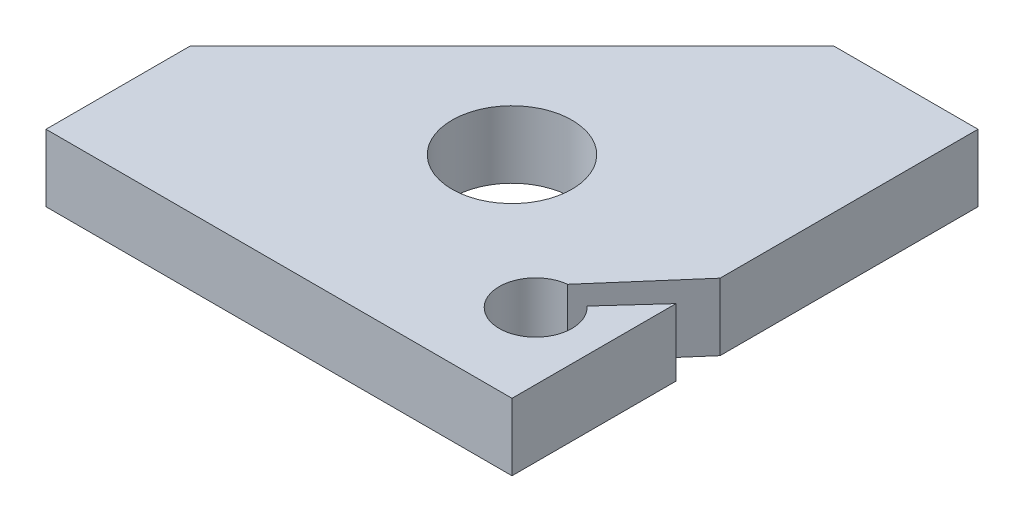
ISO-10303-21;
HEADER;
FILE_DESCRIPTION(('STEP AP214'),'2;1');
FILE_NAME('part.step','',(''),(''),'','','');
FILE_SCHEMA(('AUTOMOTIVE_DESIGN { 1 0 10303 214 1 1 1 1 }'));
ENDSEC;
DATA;
#1=APPLICATION_CONTEXT('core data for automotive mechanical design processes');
#2=APPLICATION_PROTOCOL_DEFINITION('international standard','automotive_design',2000,#1);
#3=PRODUCT_CONTEXT('',#1,'mechanical');
#4=PRODUCT('Part','Part','',(#3));
#5=PRODUCT_RELATED_PRODUCT_CATEGORY('part','',(#4));
#6=PRODUCT_DEFINITION_FORMATION('','',#4);
#7=PRODUCT_DEFINITION_CONTEXT('part definition',#1,'design');
#8=PRODUCT_DEFINITION('design','',#6,#7);
#9=PRODUCT_DEFINITION_SHAPE('','',#8);
#10=(LENGTH_UNIT() NAMED_UNIT(*) SI_UNIT(.MILLI.,.METRE.));
#11=(NAMED_UNIT(*) PLANE_ANGLE_UNIT() SI_UNIT($,.RADIAN.));
#12=(NAMED_UNIT(*) SI_UNIT($,.STERADIAN.) SOLID_ANGLE_UNIT());
#13=UNCERTAINTY_MEASURE_WITH_UNIT(LENGTH_MEASURE(1.E-05),#10,'distance_accuracy_value','');
#14=(GEOMETRIC_REPRESENTATION_CONTEXT(3) GLOBAL_UNCERTAINTY_ASSIGNED_CONTEXT((#13)) GLOBAL_UNIT_ASSIGNED_CONTEXT((#10,
#11,#12)) REPRESENTATION_CONTEXT('',''));
#15=CARTESIAN_POINT('',(0.,0.,0.));
#16=DIRECTION('',(0.,0.,1.));
#17=DIRECTION('',(1.,0.,0.));
#18=AXIS2_PLACEMENT_3D('',#15,#16,#17);
#19=CARTESIAN_POINT('',(80.3728592160939,7.,102.56766366229));
#20=DIRECTION('',(0.,1.,0.));
#21=DIRECTION('',(0.,0.,1.));
#22=AXIS2_PLACEMENT_3D('',#19,#20,#21);
#23=PLANE('',#22);
#24=DIRECTION('',(0.,0.,-1.));
#25=VECTOR('',#24,1.);
#26=CARTESIAN_POINT('',(87.34,7.,90.2962567461085));
#27=LINE('',#26,#25);
#28=CARTESIAN_POINT('',(87.34,7.,90.2962567461085));
#29=VERTEX_POINT('',#28);
#30=CARTESIAN_POINT('',(87.34,7.,63.4051780117579));
#31=VERTEX_POINT('',#30);
#32=EDGE_CURVE('E173',#29,#31,#27,.T.);
#33=ORIENTED_EDGE('',*,*,#32,.T.);
#34=DIRECTION('',(-1.,0.,0.));
#35=VECTOR('',#34,1.);
#36=CARTESIAN_POINT('',(72.34,7.,63.4051780117579));
#37=LINE('',#36,#35);
#38=CARTESIAN_POINT('',(72.34,7.,63.4051780117579));
#39=VERTEX_POINT('',#38);
#40=EDGE_CURVE('E103',#31,#39,#37,.T.);
#41=ORIENTED_EDGE('',*,*,#40,.T.);
#42=DIRECTION('',(-0.707106781186547,0.,0.707106781186547));
#43=VECTOR('',#42,1.);
#44=CARTESIAN_POINT('',(72.34,7.,63.4051780117579));
#45=LINE('',#44,#43);
#46=CARTESIAN_POINT('',(38.75,7.,96.9951780117579));
#47=VERTEX_POINT('',#46);
#48=EDGE_CURVE('E198',#39,#47,#45,.T.);
#49=ORIENTED_EDGE('',*,*,#48,.T.);
#50=DIRECTION('',(0.,0.,1.));
#51=VECTOR('',#50,1.);
#52=CARTESIAN_POINT('',(38.75,7.,96.9951780117579));
#53=LINE('',#52,#51);
#54=CARTESIAN_POINT('',(38.75,7.,111.995178011758));
#55=VERTEX_POINT('',#54);
#56=EDGE_CURVE('E216',#47,#55,#53,.T.);
#57=ORIENTED_EDGE('',*,*,#56,.T.);
#58=DIRECTION('',(1.,0.,0.));
#59=VECTOR('',#58,1.);
#60=CARTESIAN_POINT('',(38.75,7.,111.995178011758));
#61=LINE('',#60,#59);
#62=CARTESIAN_POINT('',(87.34,7.,111.995178011758));
#63=VERTEX_POINT('',#62);
#64=EDGE_CURVE('E214',#55,#63,#61,.T.);
#65=ORIENTED_EDGE('',*,*,#64,.T.);
#66=DIRECTION('',(0.,0.,-1.));
#67=VECTOR('',#66,1.);
#68=CARTESIAN_POINT('',(87.34,7.,94.8962567461085));
#69=LINE('',#68,#67);
#70=CARTESIAN_POINT('',(87.34,7.,94.8962567461085));
#71=VERTEX_POINT('',#70);
#72=EDGE_CURVE('E125',#63,#71,#69,.T.);
#73=ORIENTED_EDGE('',*,*,#72,.T.);
#74=DIRECTION('',(-0.672309985685125,0.,0.740269736750103));
#75=VECTOR('',#74,1.);
#76=CARTESIAN_POINT('',(82.9226615046045,7.,99.7601172788212));
#77=LINE('',#76,#75);
#78=CARTESIAN_POINT('',(82.9226615046045,7.,99.7601172788213));
#79=VERTEX_POINT('',#78);
#80=EDGE_CURVE('E119',#71,#79,#77,.T.);
#81=ORIENTED_EDGE('',*,*,#80,.T.);
#82=CARTESIAN_POINT('',(80.3728592160939,7.,102.56766366229));
#83=DIRECTION('',(0.,-1.,0.));
#84=DIRECTION('',(0.,0.,1.));
#85=AXIS2_PLACEMENT_3D('',#82,#83,#84);
#86=CIRCLE('',#85,3.79259916229294);
#87=CARTESIAN_POINT('',(79.9487511440119,7.,98.7988520791757));
#88=VERTEX_POINT('',#87);
#89=EDGE_CURVE('E123',#79,#88,#86,.T.);
#90=ORIENTED_EDGE('',*,*,#89,.T.);
#91=DIRECTION('',(0.656061834728694,0.,-0.75470714122262));
#92=VECTOR('',#91,1.);
#93=CARTESIAN_POINT('',(87.34,7.,90.2962567461085));
#94=LINE('',#93,#92);
#95=EDGE_CURVE('E57',#88,#29,#94,.T.);
#96=ORIENTED_EDGE('',*,*,#95,.T.);
#97=EDGE_LOOP('',(#33,#41,#49,#57,#65,#73,#81,#90,#96));
#98=FACE_BOUND('',#97,.T.);
#99=CARTESIAN_POINT('',(65.34,7.,89.9951780117579));
#100=DIRECTION('',(0.,1.,0.));
#101=DIRECTION('',(0.,0.,1.));
#102=AXIS2_PLACEMENT_3D('',#99,#100,#101);
#103=CIRCLE('',#102,6.25);
#104=CARTESIAN_POINT('',(65.34,7.,96.2451780117579));
#105=VERTEX_POINT('',#104);
#106=EDGE_CURVE('E152',#105,#105,#103,.T.);
#107=ORIENTED_EDGE('',*,*,#106,.F.);
#108=EDGE_LOOP('',(#107));
#109=FACE_BOUND('',#108,.T.);
#110=ADVANCED_FACE('F39',(#98,#109),#23,.T.);
#111=CARTESIAN_POINT('',(80.3728592160939,0.,102.56766366229));
#112=DIRECTION('',(0.,1.,0.));
#113=DIRECTION('',(0.,0.,1.));
#114=AXIS2_PLACEMENT_3D('',#111,#112,#113);
#115=PLANE('',#114);
#116=DIRECTION('',(0.,0.,-1.));
#117=VECTOR('',#116,1.);
#118=CARTESIAN_POINT('',(87.34,0.,90.2962567461085));
#119=LINE('',#118,#117);
#120=CARTESIAN_POINT('',(87.34,0.,90.2962567461085));
#121=VERTEX_POINT('',#120);
#122=CARTESIAN_POINT('',(87.34,0.,63.4051780117579));
#123=VERTEX_POINT('',#122);
#124=EDGE_CURVE('E147',#121,#123,#119,.T.);
#125=ORIENTED_EDGE('',*,*,#124,.F.);
#126=DIRECTION('',(0.656061834728694,0.,-0.75470714122262));
#127=VECTOR('',#126,1.);
#128=CARTESIAN_POINT('',(87.34,0.,90.2962567461085));
#129=LINE('',#128,#127);
#130=CARTESIAN_POINT('',(79.9487511440119,0.,98.7988520791757));
#131=VERTEX_POINT('',#130);
#132=EDGE_CURVE('E95',#131,#121,#129,.T.);
#133=ORIENTED_EDGE('',*,*,#132,.F.);
#134=CARTESIAN_POINT('',(80.3728592160939,0.,102.56766366229));
#135=DIRECTION('',(0.,-1.,0.));
#136=DIRECTION('',(0.,0.,1.));
#137=AXIS2_PLACEMENT_3D('',#134,#135,#136);
#138=CIRCLE('',#137,3.79259916229294);
#139=CARTESIAN_POINT('',(82.9226615046045,0.,99.7601172788213));
#140=VERTEX_POINT('',#139);
#141=EDGE_CURVE('E89',#140,#131,#138,.T.);
#142=ORIENTED_EDGE('',*,*,#141,.F.);
#143=DIRECTION('',(-0.672309985685125,0.,0.740269736750103));
#144=VECTOR('',#143,1.);
#145=CARTESIAN_POINT('',(82.9226615046045,0.,99.7601172788212));
#146=LINE('',#145,#144);
#147=CARTESIAN_POINT('',(87.34,0.,94.8962567461085));
#148=VERTEX_POINT('',#147);
#149=EDGE_CURVE('E134',#148,#140,#146,.T.);
#150=ORIENTED_EDGE('',*,*,#149,.F.);
#151=DIRECTION('',(0.,0.,-1.));
#152=VECTOR('',#151,1.);
#153=CARTESIAN_POINT('',(87.34,0.,94.8962567461085));
#154=LINE('',#153,#152);
#155=CARTESIAN_POINT('',(87.34,0.,111.995178011758));
#156=VERTEX_POINT('',#155);
#157=EDGE_CURVE('E164',#156,#148,#154,.T.);
#158=ORIENTED_EDGE('',*,*,#157,.F.);
#159=DIRECTION('',(1.,0.,0.));
#160=VECTOR('',#159,1.);
#161=CARTESIAN_POINT('',(38.75,0.,111.995178011758));
#162=LINE('',#161,#160);
#163=CARTESIAN_POINT('',(38.75,0.,111.995178011758));
#164=VERTEX_POINT('',#163);
#165=EDGE_CURVE('E161',#164,#156,#162,.T.);
#166=ORIENTED_EDGE('',*,*,#165,.F.);
#167=DIRECTION('',(0.,0.,1.));
#168=VECTOR('',#167,1.);
#169=CARTESIAN_POINT('',(38.75,0.,96.9951780117579));
#170=LINE('',#169,#168);
#171=CARTESIAN_POINT('',(38.75,0.,96.9951780117579));
#172=VERTEX_POINT('',#171);
#173=EDGE_CURVE('E158',#172,#164,#170,.T.);
#174=ORIENTED_EDGE('',*,*,#173,.F.);
#175=DIRECTION('',(-0.707106781186547,0.,0.707106781186547));
#176=VECTOR('',#175,1.);
#177=CARTESIAN_POINT('',(72.34,0.,63.4051780117579));
#178=LINE('',#177,#176);
#179=CARTESIAN_POINT('',(72.34,0.,63.4051780117579));
#180=VERTEX_POINT('',#179);
#181=EDGE_CURVE('E155',#180,#172,#178,.T.);
#182=ORIENTED_EDGE('',*,*,#181,.F.);
#183=DIRECTION('',(-1.,0.,0.));
#184=VECTOR('',#183,1.);
#185=CARTESIAN_POINT('',(72.34,0.,63.4051780117579));
#186=LINE('',#185,#184);
#187=EDGE_CURVE('E151',#123,#180,#186,.T.);
#188=ORIENTED_EDGE('',*,*,#187,.F.);
#189=EDGE_LOOP('',(#125,#133,#142,#150,#158,#166,#174,#182,#188));
#190=FACE_BOUND('',#189,.T.);
#191=CARTESIAN_POINT('',(65.34,0.,89.9951780117579));
#192=DIRECTION('',(0.,1.,0.));
#193=DIRECTION('',(0.,0.,1.));
#194=AXIS2_PLACEMENT_3D('',#191,#192,#193);
#195=CIRCLE('',#194,6.25);
#196=CARTESIAN_POINT('',(65.34,0.,96.2451780117579));
#197=VERTEX_POINT('',#196);
#198=EDGE_CURVE('E228',#197,#197,#195,.T.);
#199=ORIENTED_EDGE('',*,*,#198,.T.);
#200=EDGE_LOOP('',(#199));
#201=FACE_BOUND('',#200,.T.);
#202=ADVANCED_FACE('F202',(#190,#201),#115,.F.);
#203=CARTESIAN_POINT('',(87.34,7.,90.2962567461085));
#204=DIRECTION('',(-1.,0.,0.));
#205=DIRECTION('',(0.,0.,1.));
#206=AXIS2_PLACEMENT_3D('',#203,#204,#205);
#207=PLANE('',#206);
#208=ORIENTED_EDGE('',*,*,#124,.T.);
#209=DIRECTION('',(0.,-1.,0.));
#210=VECTOR('',#209,1.);
#211=CARTESIAN_POINT('',(87.34,7.,63.4051780117579));
#212=LINE('',#211,#210);
#213=EDGE_CURVE('E11',#31,#123,#212,.T.);
#214=ORIENTED_EDGE('',*,*,#213,.F.);
#215=ORIENTED_EDGE('',*,*,#32,.F.);
#216=DIRECTION('',(0.,-1.,0.));
#217=VECTOR('',#216,1.);
#218=CARTESIAN_POINT('',(87.34,7.,90.2962567461085));
#219=LINE('',#218,#217);
#220=EDGE_CURVE('E143',#29,#121,#219,.T.);
#221=ORIENTED_EDGE('',*,*,#220,.T.);
#222=EDGE_LOOP('',(#208,#214,#215,#221));
#223=FACE_BOUND('',#222,.T.);
#224=ADVANCED_FACE('F41',(#223),#207,.F.);
#225=CARTESIAN_POINT('',(72.34,7.,63.4051780117579));
#226=DIRECTION('',(0.,0.,1.));
#227=DIRECTION('',(1.,0.,0.));
#228=AXIS2_PLACEMENT_3D('',#225,#226,#227);
#229=PLANE('',#228);
#230=ORIENTED_EDGE('',*,*,#187,.T.);
#231=DIRECTION('',(0.,-1.,0.));
#232=VECTOR('',#231,1.);
#233=CARTESIAN_POINT('',(72.34,7.,63.4051780117579));
#234=LINE('',#233,#232);
#235=EDGE_CURVE('E49',#39,#180,#234,.T.);
#236=ORIENTED_EDGE('',*,*,#235,.F.);
#237=ORIENTED_EDGE('',*,*,#40,.F.);
#238=ORIENTED_EDGE('',*,*,#213,.T.);
#239=EDGE_LOOP('',(#230,#236,#237,#238));
#240=FACE_BOUND('',#239,.T.);
#241=ADVANCED_FACE('F262',(#240),#229,.F.);
#242=CARTESIAN_POINT('',(72.34,7.,63.4051780117579));
#243=DIRECTION('',(0.707106781186548,0.,0.707106781186548));
#244=DIRECTION('',(0.707106781186548,0.,-0.707106781186548));
#245=AXIS2_PLACEMENT_3D('',#242,#243,#244);
#246=PLANE('',#245);
#247=ORIENTED_EDGE('',*,*,#181,.T.);
#248=DIRECTION('',(0.,-1.,0.));
#249=VECTOR('',#248,1.);
#250=CARTESIAN_POINT('',(38.75,7.,96.9951780117579));
#251=LINE('',#250,#249);
#252=EDGE_CURVE('E188',#47,#172,#251,.T.);
#253=ORIENTED_EDGE('',*,*,#252,.F.);
#254=ORIENTED_EDGE('',*,*,#48,.F.);
#255=ORIENTED_EDGE('',*,*,#235,.T.);
#256=EDGE_LOOP('',(#247,#253,#254,#255));
#257=FACE_BOUND('',#256,.T.);
#258=ADVANCED_FACE('F196',(#257),#246,.F.);
#259=CARTESIAN_POINT('',(38.75,7.,96.9951780117579));
#260=DIRECTION('',(1.,0.,0.));
#261=DIRECTION('',(0.,0.,-1.));
#262=AXIS2_PLACEMENT_3D('',#259,#260,#261);
#263=PLANE('',#262);
#264=ORIENTED_EDGE('',*,*,#173,.T.);
#265=DIRECTION('',(0.,-1.,0.));
#266=VECTOR('',#265,1.);
#267=CARTESIAN_POINT('',(38.75,7.,111.995178011758));
#268=LINE('',#267,#266);
#269=EDGE_CURVE('E184',#55,#164,#268,.T.);
#270=ORIENTED_EDGE('',*,*,#269,.F.);
#271=ORIENTED_EDGE('',*,*,#56,.F.);
#272=ORIENTED_EDGE('',*,*,#252,.T.);
#273=EDGE_LOOP('',(#264,#270,#271,#272));
#274=FACE_BOUND('',#273,.T.);
#275=ADVANCED_FACE('F208',(#274),#263,.F.);
#276=CARTESIAN_POINT('',(38.75,7.,111.995178011758));
#277=DIRECTION('',(0.,0.,-1.));
#278=DIRECTION('',(-1.,0.,0.));
#279=AXIS2_PLACEMENT_3D('',#276,#277,#278);
#280=PLANE('',#279);
#281=ORIENTED_EDGE('',*,*,#165,.T.);
#282=DIRECTION('',(0.,-1.,0.));
#283=VECTOR('',#282,1.);
#284=CARTESIAN_POINT('',(87.34,7.,111.995178011758));
#285=LINE('',#284,#283);
#286=EDGE_CURVE('E180',#63,#156,#285,.T.);
#287=ORIENTED_EDGE('',*,*,#286,.F.);
#288=ORIENTED_EDGE('',*,*,#64,.F.);
#289=ORIENTED_EDGE('',*,*,#269,.T.);
#290=EDGE_LOOP('',(#281,#287,#288,#289));
#291=FACE_BOUND('',#290,.T.);
#292=ADVANCED_FACE('F212',(#291),#280,.F.);
#293=CARTESIAN_POINT('',(87.34,7.,94.8962567461085));
#294=DIRECTION('',(-1.,0.,0.));
#295=DIRECTION('',(0.,0.,1.));
#296=AXIS2_PLACEMENT_3D('',#293,#294,#295);
#297=PLANE('',#296);
#298=ORIENTED_EDGE('',*,*,#157,.T.);
#299=DIRECTION('',(0.,-1.,0.));
#300=VECTOR('',#299,1.);
#301=CARTESIAN_POINT('',(87.34,7.,94.8962567461085));
#302=LINE('',#301,#300);
#303=EDGE_CURVE('E136',#71,#148,#302,.T.);
#304=ORIENTED_EDGE('',*,*,#303,.F.);
#305=ORIENTED_EDGE('',*,*,#72,.F.);
#306=ORIENTED_EDGE('',*,*,#286,.T.);
#307=EDGE_LOOP('',(#298,#304,#305,#306));
#308=FACE_BOUND('',#307,.T.);
#309=ADVANCED_FACE('F253',(#308),#297,.F.);
#310=CARTESIAN_POINT('',(82.9226615046045,7.,99.7601172788212));
#311=DIRECTION('',(0.740269736750103,0.,0.672309985685125));
#312=DIRECTION('',(0.672309985685125,0.,-0.740269736750103));
#313=AXIS2_PLACEMENT_3D('',#310,#311,#312);
#314=PLANE('',#313);
#315=ORIENTED_EDGE('',*,*,#149,.T.);
#316=DIRECTION('',(0.,-1.,0.));
#317=VECTOR('',#316,1.);
#318=CARTESIAN_POINT('',(82.9226615046045,7.,99.7601172788213));
#319=LINE('',#318,#317);
#320=EDGE_CURVE('E131',#79,#140,#319,.T.);
#321=ORIENTED_EDGE('',*,*,#320,.F.);
#322=ORIENTED_EDGE('',*,*,#80,.F.);
#323=ORIENTED_EDGE('',*,*,#303,.T.);
#324=EDGE_LOOP('',(#315,#321,#322,#323));
#325=FACE_BOUND('',#324,.T.);
#326=ADVANCED_FACE('F132',(#325),#314,.F.);
#327=CARTESIAN_POINT('',(80.3728592160939,7.,102.56766366229));
#328=DIRECTION('',(0.,-1.,0.));
#329=DIRECTION('',(0.,0.,-1.));
#330=AXIS2_PLACEMENT_3D('',#327,#328,#329);
#331=CYLINDRICAL_SURFACE('',#330,3.79259916229294);
#332=ORIENTED_EDGE('',*,*,#141,.T.);
#333=DIRECTION('',(0.,-1.,0.));
#334=VECTOR('',#333,1.);
#335=CARTESIAN_POINT('',(79.9487511440119,7.,98.7988520791757));
#336=LINE('',#335,#334);
#337=EDGE_CURVE('E137',#88,#131,#336,.T.);
#338=ORIENTED_EDGE('',*,*,#337,.F.);
#339=ORIENTED_EDGE('',*,*,#89,.F.);
#340=ORIENTED_EDGE('',*,*,#320,.T.);
#341=EDGE_LOOP('',(#332,#338,#339,#340));
#342=FACE_BOUND('',#341,.T.);
#343=ADVANCED_FACE('F139',(#342),#331,.F.);
#344=CARTESIAN_POINT('',(87.34,7.,90.2962567461085));
#345=DIRECTION('',(-0.75470714122262,0.,-0.656061834728694));
#346=DIRECTION('',(-0.656061834728694,0.,0.75470714122262));
#347=AXIS2_PLACEMENT_3D('',#344,#345,#346);
#348=PLANE('',#347);
#349=ORIENTED_EDGE('',*,*,#132,.T.);
#350=ORIENTED_EDGE('',*,*,#220,.F.);
#351=ORIENTED_EDGE('',*,*,#95,.F.);
#352=ORIENTED_EDGE('',*,*,#337,.T.);
#353=EDGE_LOOP('',(#349,#350,#351,#352));
#354=FACE_BOUND('',#353,.T.);
#355=ADVANCED_FACE('F246',(#354),#348,.F.);
#356=CARTESIAN_POINT('',(65.34,7.,89.9951780117579));
#357=DIRECTION('',(0.,-1.,0.));
#358=DIRECTION('',(0.,0.,-1.));
#359=AXIS2_PLACEMENT_3D('',#356,#357,#358);
#360=CYLINDRICAL_SURFACE('',#359,6.25);
#361=ORIENTED_EDGE('',*,*,#106,.T.);
#362=EDGE_LOOP('',(#361));
#363=FACE_BOUND('',#362,.T.);
#364=ORIENTED_EDGE('',*,*,#198,.F.);
#365=EDGE_LOOP('',(#364));
#366=FACE_BOUND('',#365,.T.);
#367=ADVANCED_FACE('F236',(#363,#366),#360,.F.);
#368=CLOSED_SHELL('',(#110,#202,#224,#241,#258,#275,#292,#309,#326,#343,#355,#367));
#369=MANIFOLD_SOLID_BREP('B2',#368);
#370=ADVANCED_BREP_SHAPE_REPRESENTATION('',(#18,#369),#14);
#371=SHAPE_DEFINITION_REPRESENTATION(#9,#370);
ENDSEC;
END-ISO-10303-21;
